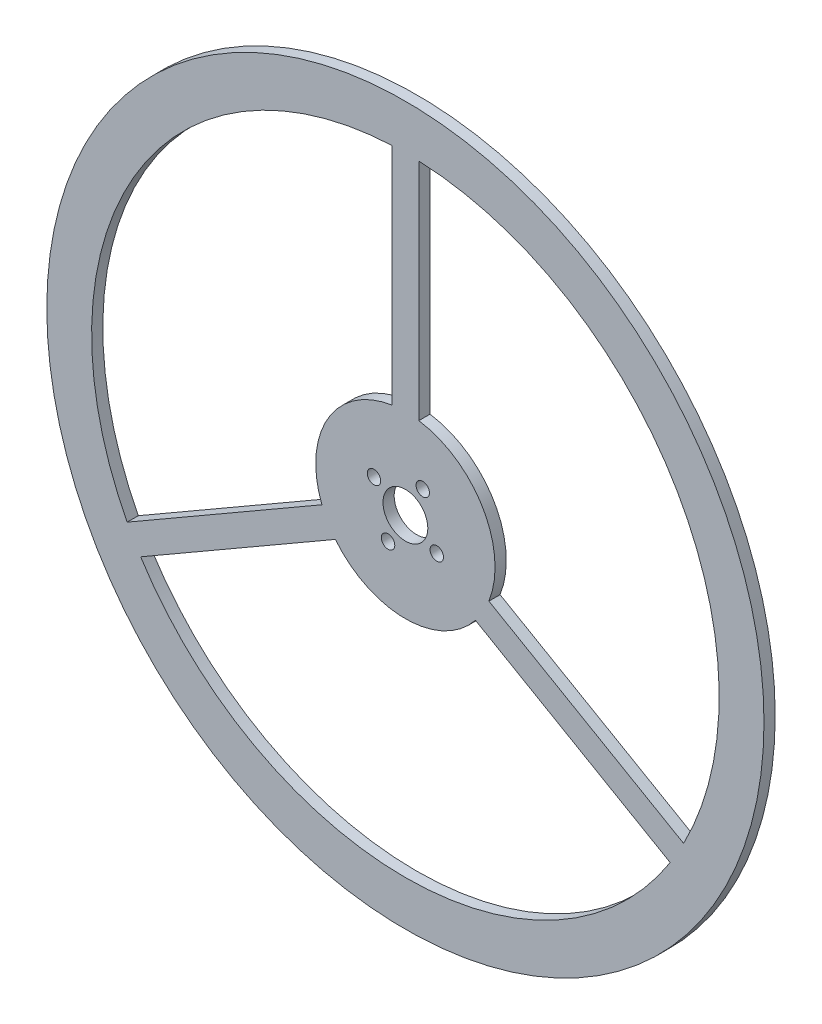
ISO-10303-21;
HEADER;
FILE_DESCRIPTION(('STEP AP214'),'2;1');
FILE_NAME('part.step','',(''),(''),'','','');
FILE_SCHEMA(('AUTOMOTIVE_DESIGN { 1 0 10303 214 1 1 1 1 }'));
ENDSEC;
DATA;
#1=APPLICATION_CONTEXT('core data for automotive mechanical design processes');
#2=APPLICATION_PROTOCOL_DEFINITION('international standard','automotive_design',2000,#1);
#3=PRODUCT_CONTEXT('',#1,'mechanical');
#4=PRODUCT('Part','Part','',(#3));
#5=PRODUCT_RELATED_PRODUCT_CATEGORY('part','',(#4));
#6=PRODUCT_DEFINITION_FORMATION('','',#4);
#7=PRODUCT_DEFINITION_CONTEXT('part definition',#1,'design');
#8=PRODUCT_DEFINITION('design','',#6,#7);
#9=PRODUCT_DEFINITION_SHAPE('','',#8);
#10=(LENGTH_UNIT() NAMED_UNIT(*) SI_UNIT(.MILLI.,.METRE.));
#11=(NAMED_UNIT(*) PLANE_ANGLE_UNIT() SI_UNIT($,.RADIAN.));
#12=(NAMED_UNIT(*) SI_UNIT($,.STERADIAN.) SOLID_ANGLE_UNIT());
#13=UNCERTAINTY_MEASURE_WITH_UNIT(LENGTH_MEASURE(1.E-05),#10,'distance_accuracy_value','');
#14=(GEOMETRIC_REPRESENTATION_CONTEXT(3) GLOBAL_UNCERTAINTY_ASSIGNED_CONTEXT((#13)) GLOBAL_UNIT_ASSIGNED_CONTEXT((#10,
#11,#12)) REPRESENTATION_CONTEXT('',''));
#15=CARTESIAN_POINT('',(0.,0.,0.));
#16=DIRECTION('',(0.,0.,1.));
#17=DIRECTION('',(1.,0.,0.));
#18=AXIS2_PLACEMENT_3D('',#15,#16,#17);
#19=CARTESIAN_POINT('',(0.,0.,2.5));
#20=DIRECTION('',(0.,0.,1.));
#21=DIRECTION('',(1.,0.,0.));
#22=AXIS2_PLACEMENT_3D('',#19,#20,#21);
#23=PLANE('',#22);
#24=CARTESIAN_POINT('',(7.00088135362442,-3.87138996646863,2.5));
#25=DIRECTION('',(0.,0.,-1.));
#26=DIRECTION('',(-1.,0.,0.));
#27=AXIS2_PLACEMENT_3D('',#24,#25,#26);
#28=CIRCLE('',#27,1.5);
#29=CARTESIAN_POINT('',(5.50088135362442,-3.87138996646863,2.5));
#30=VERTEX_POINT('',#29);
#31=EDGE_CURVE('E155',#30,#30,#28,.T.);
#32=ORIENTED_EDGE('',*,*,#31,.T.);
#33=EDGE_LOOP('',(#32));
#34=FACE_BOUND('',#33,.T.);
#35=CARTESIAN_POINT('',(3.87138996646861,7.00088135362444,2.5));
#36=DIRECTION('',(0.,0.,-1.));
#37=DIRECTION('',(-1.,0.,0.));
#38=AXIS2_PLACEMENT_3D('',#35,#36,#37);
#39=CIRCLE('',#38,1.5);
#40=CARTESIAN_POINT('',(2.37138996646861,7.00088135362444,2.5));
#41=VERTEX_POINT('',#40);
#42=EDGE_CURVE('E499',#41,#41,#39,.T.);
#43=ORIENTED_EDGE('',*,*,#42,.T.);
#44=EDGE_LOOP('',(#43));
#45=FACE_BOUND('',#44,.T.);
#46=CARTESIAN_POINT('',(-7.00088135362445,3.87138996646858,2.5));
#47=DIRECTION('',(0.,0.,-1.));
#48=DIRECTION('',(-1.,0.,0.));
#49=AXIS2_PLACEMENT_3D('',#46,#47,#48);
#50=CIRCLE('',#49,1.5);
#51=CARTESIAN_POINT('',(-8.50088135362445,3.87138996646858,2.5));
#52=VERTEX_POINT('',#51);
#53=EDGE_CURVE('E507',#52,#52,#50,.T.);
#54=ORIENTED_EDGE('',*,*,#53,.T.);
#55=EDGE_LOOP('',(#54));
#56=FACE_BOUND('',#55,.T.);
#57=CARTESIAN_POINT('',(-3.87138996646856,-7.00088135362446,2.5));
#58=DIRECTION('',(0.,0.,-1.));
#59=DIRECTION('',(-1.,0.,0.));
#60=AXIS2_PLACEMENT_3D('',#57,#58,#59);
#61=CIRCLE('',#60,1.5);
#62=CARTESIAN_POINT('',(-5.37138996646856,-7.00088135362446,2.5));
#63=VERTEX_POINT('',#62);
#64=EDGE_CURVE('E512',#63,#63,#61,.T.);
#65=ORIENTED_EDGE('',*,*,#64,.T.);
#66=EDGE_LOOP('',(#65));
#67=FACE_BOUND('',#66,.T.);
#68=DIRECTION('',(0.,1.,0.));
#69=VECTOR('',#68,1.);
#70=CARTESIAN_POINT('',(-3.,19.7737199332852,2.5));
#71=LINE('',#70,#69);
#72=CARTESIAN_POINT('',(-3.,19.7737199332852,2.5));
#73=VERTEX_POINT('',#72);
#74=CARTESIAN_POINT('',(-3.,69.9356847396235,2.5));
#75=VERTEX_POINT('',#74);
#76=EDGE_CURVE('E204',#73,#75,#71,.T.);
#77=ORIENTED_EDGE('',*,*,#76,.F.);
#78=CARTESIAN_POINT('',(0.,0.,2.5));
#79=DIRECTION('',(0.,0.,-1.));
#80=DIRECTION('',(1.,0.,0.));
#81=AXIS2_PLACEMENT_3D('',#78,#79,#80);
#82=CIRCLE('',#81,20.);
#83=CARTESIAN_POINT('',(-18.6245437895437,-7.28878375528927,2.5));
#84=VERTEX_POINT('',#83);
#85=EDGE_CURVE('E202',#84,#73,#82,.T.);
#86=ORIENTED_EDGE('',*,*,#85,.F.);
#87=DIRECTION('',(0.866025403784438,0.5,0.));
#88=VECTOR('',#87,1.);
#89=CARTESIAN_POINT('',(-18.6245437895437,-7.28878375528927,2.5));
#90=LINE('',#89,#88);
#91=CARTESIAN_POINT('',(-62.0660796155736,-32.3697661584584,2.5));
#92=VERTEX_POINT('',#91);
#93=EDGE_CURVE('E210',#92,#84,#90,.T.);
#94=ORIENTED_EDGE('',*,*,#93,.F.);
#95=CARTESIAN_POINT('',(0.,0.,2.5));
#96=DIRECTION('',(0.,0.,1.));
#97=DIRECTION('',(1.,0.,0.));
#98=AXIS2_PLACEMENT_3D('',#95,#96,#97);
#99=CIRCLE('',#98,70.);
#100=EDGE_CURVE('E207',#75,#92,#99,.T.);
#101=ORIENTED_EDGE('',*,*,#100,.F.);
#102=EDGE_LOOP('',(#77,#86,#94,#101));
#103=FACE_BOUND('',#102,.T.);
#104=CARTESIAN_POINT('',(0.,0.,2.5));
#105=DIRECTION('',(0.,0.,1.));
#106=DIRECTION('',(1.,0.,0.));
#107=AXIS2_PLACEMENT_3D('',#104,#105,#106);
#108=CIRCLE('',#107,80.);
#109=CARTESIAN_POINT('',(80.,0.,2.5));
#110=VERTEX_POINT('',#109);
#111=EDGE_CURVE('E11',#110,#110,#108,.T.);
#112=ORIENTED_EDGE('',*,*,#111,.T.);
#113=EDGE_LOOP('',(#112));
#114=FACE_BOUND('',#113,.T.);
#115=CARTESIAN_POINT('',(0.,0.,2.5));
#116=DIRECTION('',(0.,0.,1.));
#117=DIRECTION('',(1.,0.,0.));
#118=AXIS2_PLACEMENT_3D('',#115,#116,#117);
#119=CIRCLE('',#118,5.);
#120=CARTESIAN_POINT('',(5.,0.,2.5));
#121=VERTEX_POINT('',#120);
#122=EDGE_CURVE('E196',#121,#121,#119,.T.);
#123=ORIENTED_EDGE('',*,*,#122,.F.);
#124=EDGE_LOOP('',(#123));
#125=FACE_BOUND('',#124,.T.);
#126=DIRECTION('',(0.866025403784439,-0.5,0.));
#127=VECTOR('',#126,1.);
#128=CARTESIAN_POINT('',(18.6245437895437,-7.28878375528927,2.5));
#129=LINE('',#128,#127);
#130=CARTESIAN_POINT('',(18.6245437895437,-7.28878375528927,2.5));
#131=VERTEX_POINT('',#130);
#132=CARTESIAN_POINT('',(62.0660796155736,-32.3697661584584,2.5));
#133=VERTEX_POINT('',#132);
#134=EDGE_CURVE('E167',#131,#133,#129,.T.);
#135=ORIENTED_EDGE('',*,*,#134,.F.);
#136=CARTESIAN_POINT('',(0.,0.,2.5));
#137=DIRECTION('',(0.,0.,-1.));
#138=DIRECTION('',(1.,0.,0.));
#139=AXIS2_PLACEMENT_3D('',#136,#137,#138);
#140=CIRCLE('',#139,20.);
#141=CARTESIAN_POINT('',(3.,19.7737199332852,2.5));
#142=VERTEX_POINT('',#141);
#143=EDGE_CURVE('E165',#142,#131,#140,.T.);
#144=ORIENTED_EDGE('',*,*,#143,.F.);
#145=DIRECTION('',(0.,-1.,0.));
#146=VECTOR('',#145,1.);
#147=CARTESIAN_POINT('',(3.,19.7737199332852,2.5));
#148=LINE('',#147,#146);
#149=CARTESIAN_POINT('',(3.,69.9356847396235,2.5));
#150=VERTEX_POINT('',#149);
#151=EDGE_CURVE('E173',#150,#142,#148,.T.);
#152=ORIENTED_EDGE('',*,*,#151,.F.);
#153=CARTESIAN_POINT('',(0.,0.,2.5));
#154=DIRECTION('',(0.,0.,1.));
#155=DIRECTION('',(1.,0.,0.));
#156=AXIS2_PLACEMENT_3D('',#153,#154,#155);
#157=CIRCLE('',#156,70.);
#158=EDGE_CURVE('E170',#133,#150,#157,.T.);
#159=ORIENTED_EDGE('',*,*,#158,.F.);
#160=EDGE_LOOP('',(#135,#144,#152,#159));
#161=FACE_BOUND('',#160,.T.);
#162=DIRECTION('',(-0.866025403784438,-0.5,0.));
#163=VECTOR('',#162,1.);
#164=CARTESIAN_POINT('',(-15.6245437895437,-12.4849361779959,2.5));
#165=LINE('',#164,#163);
#166=CARTESIAN_POINT('',(-15.6245437895437,-12.4849361779959,2.5));
#167=VERTEX_POINT('',#166);
#168=CARTESIAN_POINT('',(-59.0660796155736,-37.5659185811651,2.5));
#169=VERTEX_POINT('',#168);
#170=EDGE_CURVE('E135',#167,#169,#165,.T.);
#171=ORIENTED_EDGE('',*,*,#170,.F.);
#172=CARTESIAN_POINT('',(0.,0.,2.5));
#173=DIRECTION('',(0.,0.,-1.));
#174=DIRECTION('',(1.,0.,0.));
#175=AXIS2_PLACEMENT_3D('',#172,#173,#174);
#176=CIRCLE('',#175,20.);
#177=CARTESIAN_POINT('',(15.6245437895437,-12.4849361779959,2.5));
#178=VERTEX_POINT('',#177);
#179=EDGE_CURVE('E127',#178,#167,#176,.T.);
#180=ORIENTED_EDGE('',*,*,#179,.F.);
#181=DIRECTION('',(-0.866025403784439,0.5,0.));
#182=VECTOR('',#181,1.);
#183=CARTESIAN_POINT('',(15.6245437895437,-12.4849361779959,2.5));
#184=LINE('',#183,#182);
#185=CARTESIAN_POINT('',(59.0660796155736,-37.565918581165,2.5));
#186=VERTEX_POINT('',#185);
#187=EDGE_CURVE('E149',#186,#178,#184,.T.);
#188=ORIENTED_EDGE('',*,*,#187,.F.);
#189=CARTESIAN_POINT('',(0.,0.,2.5));
#190=DIRECTION('',(0.,0.,1.));
#191=DIRECTION('',(1.,0.,0.));
#192=AXIS2_PLACEMENT_3D('',#189,#190,#191);
#193=CIRCLE('',#192,70.);
#194=EDGE_CURVE('E147',#169,#186,#193,.T.);
#195=ORIENTED_EDGE('',*,*,#194,.F.);
#196=EDGE_LOOP('',(#171,#180,#188,#195));
#197=FACE_BOUND('',#196,.T.);
#198=ADVANCED_FACE('F38',(#34,#45,#56,#67,#103,#114,#125,#161,#197),#23,.T.);
#199=CARTESIAN_POINT('',(0.,0.,0.));
#200=DIRECTION('',(0.,0.,1.));
#201=DIRECTION('',(1.,0.,0.));
#202=AXIS2_PLACEMENT_3D('',#199,#200,#201);
#203=PLANE('',#202);
#204=CARTESIAN_POINT('',(7.00088135362442,-3.87138996646863,0.));
#205=DIRECTION('',(0.,0.,-1.));
#206=DIRECTION('',(-1.,0.,0.));
#207=AXIS2_PLACEMENT_3D('',#204,#205,#206);
#208=CIRCLE('',#207,1.5);
#209=CARTESIAN_POINT('',(5.50088135362442,-3.87138996646863,0.));
#210=VERTEX_POINT('',#209);
#211=EDGE_CURVE('E494',#210,#210,#208,.T.);
#212=ORIENTED_EDGE('',*,*,#211,.F.);
#213=EDGE_LOOP('',(#212));
#214=FACE_BOUND('',#213,.T.);
#215=CARTESIAN_POINT('',(3.87138996646861,7.00088135362444,0.));
#216=DIRECTION('',(0.,0.,-1.));
#217=DIRECTION('',(-1.,0.,0.));
#218=AXIS2_PLACEMENT_3D('',#215,#216,#217);
#219=CIRCLE('',#218,1.5);
#220=CARTESIAN_POINT('',(2.37138996646861,7.00088135362444,0.));
#221=VERTEX_POINT('',#220);
#222=EDGE_CURVE('E495',#221,#221,#219,.T.);
#223=ORIENTED_EDGE('',*,*,#222,.F.);
#224=EDGE_LOOP('',(#223));
#225=FACE_BOUND('',#224,.T.);
#226=CARTESIAN_POINT('',(-7.00088135362445,3.87138996646858,0.));
#227=DIRECTION('',(0.,0.,-1.));
#228=DIRECTION('',(-1.,0.,0.));
#229=AXIS2_PLACEMENT_3D('',#226,#227,#228);
#230=CIRCLE('',#229,1.5);
#231=CARTESIAN_POINT('',(-8.50088135362445,3.87138996646858,0.));
#232=VERTEX_POINT('',#231);
#233=EDGE_CURVE('E504',#232,#232,#230,.T.);
#234=ORIENTED_EDGE('',*,*,#233,.F.);
#235=EDGE_LOOP('',(#234));
#236=FACE_BOUND('',#235,.T.);
#237=CARTESIAN_POINT('',(-3.87138996646856,-7.00088135362446,0.));
#238=DIRECTION('',(0.,0.,-1.));
#239=DIRECTION('',(-1.,0.,0.));
#240=AXIS2_PLACEMENT_3D('',#237,#238,#239);
#241=CIRCLE('',#240,1.5);
#242=CARTESIAN_POINT('',(-5.37138996646856,-7.00088135362446,0.));
#243=VERTEX_POINT('',#242);
#244=EDGE_CURVE('E510',#243,#243,#241,.T.);
#245=ORIENTED_EDGE('',*,*,#244,.F.);
#246=EDGE_LOOP('',(#245));
#247=FACE_BOUND('',#246,.T.);
#248=CARTESIAN_POINT('',(0.,0.,0.));
#249=DIRECTION('',(0.,0.,-1.));
#250=DIRECTION('',(1.,0.,0.));
#251=AXIS2_PLACEMENT_3D('',#248,#249,#250);
#252=CIRCLE('',#251,20.);
#253=CARTESIAN_POINT('',(3.,19.7737199332852,0.));
#254=VERTEX_POINT('',#253);
#255=CARTESIAN_POINT('',(18.6245437895437,-7.28878375528927,0.));
#256=VERTEX_POINT('',#255);
#257=EDGE_CURVE('E143',#254,#256,#252,.T.);
#258=ORIENTED_EDGE('',*,*,#257,.T.);
#259=DIRECTION('',(0.866025403784439,-0.5,0.));
#260=VECTOR('',#259,1.);
#261=CARTESIAN_POINT('',(18.6245437895437,-7.28878375528927,0.));
#262=LINE('',#261,#260);
#263=CARTESIAN_POINT('',(62.0660796155736,-32.3697661584584,0.));
#264=VERTEX_POINT('',#263);
#265=EDGE_CURVE('E178',#256,#264,#262,.T.);
#266=ORIENTED_EDGE('',*,*,#265,.T.);
#267=CARTESIAN_POINT('',(0.,0.,0.));
#268=DIRECTION('',(0.,0.,1.));
#269=DIRECTION('',(1.,0.,0.));
#270=AXIS2_PLACEMENT_3D('',#267,#268,#269);
#271=CIRCLE('',#270,70.);
#272=CARTESIAN_POINT('',(3.,69.9356847396235,0.));
#273=VERTEX_POINT('',#272);
#274=EDGE_CURVE('E181',#264,#273,#271,.T.);
#275=ORIENTED_EDGE('',*,*,#274,.T.);
#276=DIRECTION('',(0.,-1.,0.));
#277=VECTOR('',#276,1.);
#278=CARTESIAN_POINT('',(3.,19.7737199332852,0.));
#279=LINE('',#278,#277);
#280=EDGE_CURVE('E168',#273,#254,#279,.T.);
#281=ORIENTED_EDGE('',*,*,#280,.T.);
#282=EDGE_LOOP('',(#258,#266,#275,#281));
#283=FACE_BOUND('',#282,.T.);
#284=CARTESIAN_POINT('',(0.,0.,0.));
#285=DIRECTION('',(0.,0.,1.));
#286=DIRECTION('',(1.,0.,0.));
#287=AXIS2_PLACEMENT_3D('',#284,#285,#286);
#288=CIRCLE('',#287,80.);
#289=CARTESIAN_POINT('',(80.,0.,0.));
#290=VERTEX_POINT('',#289);
#291=EDGE_CURVE('E42',#290,#290,#288,.T.);
#292=ORIENTED_EDGE('',*,*,#291,.F.);
#293=EDGE_LOOP('',(#292));
#294=FACE_BOUND('',#293,.T.);
#295=CARTESIAN_POINT('',(0.,0.,0.));
#296=DIRECTION('',(0.,0.,-1.));
#297=DIRECTION('',(1.,0.,0.));
#298=AXIS2_PLACEMENT_3D('',#295,#296,#297);
#299=CIRCLE('',#298,20.);
#300=CARTESIAN_POINT('',(-18.6245437895437,-7.28878375528927,0.));
#301=VERTEX_POINT('',#300);
#302=CARTESIAN_POINT('',(-3.,19.7737199332852,0.));
#303=VERTEX_POINT('',#302);
#304=EDGE_CURVE('E199',#301,#303,#299,.T.);
#305=ORIENTED_EDGE('',*,*,#304,.T.);
#306=DIRECTION('',(0.,1.,0.));
#307=VECTOR('',#306,1.);
#308=CARTESIAN_POINT('',(-3.,19.7737199332852,0.));
#309=LINE('',#308,#307);
#310=CARTESIAN_POINT('',(-3.,69.9356847396235,0.));
#311=VERTEX_POINT('',#310);
#312=EDGE_CURVE('E215',#303,#311,#309,.T.);
#313=ORIENTED_EDGE('',*,*,#312,.T.);
#314=CARTESIAN_POINT('',(0.,0.,0.));
#315=DIRECTION('',(0.,0.,1.));
#316=DIRECTION('',(1.,0.,0.));
#317=AXIS2_PLACEMENT_3D('',#314,#315,#316);
#318=CIRCLE('',#317,70.);
#319=CARTESIAN_POINT('',(-62.0660796155736,-32.3697661584584,0.));
#320=VERTEX_POINT('',#319);
#321=EDGE_CURVE('E218',#311,#320,#318,.T.);
#322=ORIENTED_EDGE('',*,*,#321,.T.);
#323=DIRECTION('',(0.866025403784438,0.5,0.));
#324=VECTOR('',#323,1.);
#325=CARTESIAN_POINT('',(-18.6245437895437,-7.28878375528927,0.));
#326=LINE('',#325,#324);
#327=EDGE_CURVE('E205',#320,#301,#326,.T.);
#328=ORIENTED_EDGE('',*,*,#327,.T.);
#329=EDGE_LOOP('',(#305,#313,#322,#328));
#330=FACE_BOUND('',#329,.T.);
#331=CARTESIAN_POINT('',(0.,0.,0.));
#332=DIRECTION('',(0.,0.,1.));
#333=DIRECTION('',(1.,0.,0.));
#334=AXIS2_PLACEMENT_3D('',#331,#332,#333);
#335=CIRCLE('',#334,5.);
#336=CARTESIAN_POINT('',(5.,0.,0.));
#337=VERTEX_POINT('',#336);
#338=EDGE_CURVE('E195',#337,#337,#335,.T.);
#339=ORIENTED_EDGE('',*,*,#338,.T.);
#340=EDGE_LOOP('',(#339));
#341=FACE_BOUND('',#340,.T.);
#342=CARTESIAN_POINT('',(0.,0.,0.));
#343=DIRECTION('',(0.,0.,-1.));
#344=DIRECTION('',(1.,0.,0.));
#345=AXIS2_PLACEMENT_3D('',#342,#343,#344);
#346=CIRCLE('',#345,20.);
#347=CARTESIAN_POINT('',(15.6245437895437,-12.4849361779959,0.));
#348=VERTEX_POINT('',#347);
#349=CARTESIAN_POINT('',(-15.6245437895437,-12.4849361779959,0.));
#350=VERTEX_POINT('',#349);
#351=EDGE_CURVE('E61',#348,#350,#346,.T.);
#352=ORIENTED_EDGE('',*,*,#351,.T.);
#353=DIRECTION('',(-0.866025403784438,-0.5,0.));
#354=VECTOR('',#353,1.);
#355=CARTESIAN_POINT('',(-15.6245437895437,-12.4849361779959,0.));
#356=LINE('',#355,#354);
#357=CARTESIAN_POINT('',(-59.0660796155736,-37.5659185811651,0.));
#358=VERTEX_POINT('',#357);
#359=EDGE_CURVE('E142',#350,#358,#356,.T.);
#360=ORIENTED_EDGE('',*,*,#359,.T.);
#361=CARTESIAN_POINT('',(0.,0.,0.));
#362=DIRECTION('',(0.,0.,1.));
#363=DIRECTION('',(1.,0.,0.));
#364=AXIS2_PLACEMENT_3D('',#361,#362,#363);
#365=CIRCLE('',#364,70.);
#366=CARTESIAN_POINT('',(59.0660796155736,-37.565918581165,0.));
#367=VERTEX_POINT('',#366);
#368=EDGE_CURVE('E157',#358,#367,#365,.T.);
#369=ORIENTED_EDGE('',*,*,#368,.T.);
#370=DIRECTION('',(-0.866025403784439,0.5,0.));
#371=VECTOR('',#370,1.);
#372=CARTESIAN_POINT('',(15.6245437895437,-12.4849361779959,0.));
#373=LINE('',#372,#371);
#374=EDGE_CURVE('E136',#367,#348,#373,.T.);
#375=ORIENTED_EDGE('',*,*,#374,.T.);
#376=EDGE_LOOP('',(#352,#360,#369,#375));
#377=FACE_BOUND('',#376,.T.);
#378=ADVANCED_FACE('F237',(#214,#225,#236,#247,#283,#294,#330,#341,#377),#203,.F.);
#379=CARTESIAN_POINT('',(0.,0.,2.5));
#380=DIRECTION('',(0.,0.,-1.));
#381=DIRECTION('',(-1.,0.,0.));
#382=AXIS2_PLACEMENT_3D('',#379,#380,#381);
#383=CYLINDRICAL_SURFACE('',#382,80.);
#384=ORIENTED_EDGE('',*,*,#111,.F.);
#385=EDGE_LOOP('',(#384));
#386=FACE_BOUND('',#385,.T.);
#387=ORIENTED_EDGE('',*,*,#291,.T.);
#388=EDGE_LOOP('',(#387));
#389=FACE_BOUND('',#388,.T.);
#390=ADVANCED_FACE('F40',(#386,#389),#383,.T.);
#391=CARTESIAN_POINT('',(0.,0.,2.5));
#392=DIRECTION('',(0.,0.,-1.));
#393=DIRECTION('',(-1.,0.,0.));
#394=AXIS2_PLACEMENT_3D('',#391,#392,#393);
#395=CYLINDRICAL_SURFACE('',#394,20.);
#396=ORIENTED_EDGE('',*,*,#304,.F.);
#397=DIRECTION('',(0.,0.,-1.));
#398=VECTOR('',#397,1.);
#399=CARTESIAN_POINT('',(-18.6245437895437,-7.28878375528927,2.5));
#400=LINE('',#399,#398);
#401=EDGE_CURVE('E212',#84,#301,#400,.T.);
#402=ORIENTED_EDGE('',*,*,#401,.F.);
#403=ORIENTED_EDGE('',*,*,#85,.T.);
#404=DIRECTION('',(0.,0.,-1.));
#405=VECTOR('',#404,1.);
#406=CARTESIAN_POINT('',(-3.,19.7737199332852,2.5));
#407=LINE('',#406,#405);
#408=EDGE_CURVE('E229',#73,#303,#407,.T.);
#409=ORIENTED_EDGE('',*,*,#408,.T.);
#410=EDGE_LOOP('',(#396,#402,#403,#409));
#411=FACE_BOUND('',#410,.T.);
#412=ADVANCED_FACE('F267',(#411),#395,.T.);
#413=CARTESIAN_POINT('',(-3.,19.7737199332852,2.5));
#414=DIRECTION('',(-1.,0.,0.));
#415=DIRECTION('',(0.,0.,1.));
#416=AXIS2_PLACEMENT_3D('',#413,#414,#415);
#417=PLANE('',#416);
#418=ORIENTED_EDGE('',*,*,#312,.F.);
#419=ORIENTED_EDGE('',*,*,#408,.F.);
#420=ORIENTED_EDGE('',*,*,#76,.T.);
#421=DIRECTION('',(0.,0.,-1.));
#422=VECTOR('',#421,1.);
#423=CARTESIAN_POINT('',(-3.,69.9356847396235,2.5));
#424=LINE('',#423,#422);
#425=EDGE_CURVE('E227',#75,#311,#424,.T.);
#426=ORIENTED_EDGE('',*,*,#425,.T.);
#427=EDGE_LOOP('',(#418,#419,#420,#426));
#428=FACE_BOUND('',#427,.T.);
#429=ADVANCED_FACE('F270',(#428),#417,.T.);
#430=CARTESIAN_POINT('',(0.,0.,2.5));
#431=DIRECTION('',(0.,0.,-1.));
#432=DIRECTION('',(-1.,0.,0.));
#433=AXIS2_PLACEMENT_3D('',#430,#431,#432);
#434=CYLINDRICAL_SURFACE('',#433,70.);
#435=ORIENTED_EDGE('',*,*,#321,.F.);
#436=ORIENTED_EDGE('',*,*,#425,.F.);
#437=ORIENTED_EDGE('',*,*,#100,.T.);
#438=DIRECTION('',(0.,0.,-1.));
#439=VECTOR('',#438,1.);
#440=CARTESIAN_POINT('',(-62.0660796155736,-32.3697661584584,2.5));
#441=LINE('',#440,#439);
#442=EDGE_CURVE('E225',#92,#320,#441,.T.);
#443=ORIENTED_EDGE('',*,*,#442,.T.);
#444=EDGE_LOOP('',(#435,#436,#437,#443));
#445=FACE_BOUND('',#444,.T.);
#446=ADVANCED_FACE('F273',(#445),#434,.F.);
#447=CARTESIAN_POINT('',(-18.6245437895437,-7.28878375528927,2.5));
#448=DIRECTION('',(-0.5,0.866025403784439,0.));
#449=DIRECTION('',(-0.866025403784439,-0.5,0.));
#450=AXIS2_PLACEMENT_3D('',#447,#448,#449);
#451=PLANE('',#450);
#452=ORIENTED_EDGE('',*,*,#327,.F.);
#453=ORIENTED_EDGE('',*,*,#442,.F.);
#454=ORIENTED_EDGE('',*,*,#93,.T.);
#455=ORIENTED_EDGE('',*,*,#401,.T.);
#456=EDGE_LOOP('',(#452,#453,#454,#455));
#457=FACE_BOUND('',#456,.T.);
#458=ADVANCED_FACE('F277',(#457),#451,.T.);
#459=CARTESIAN_POINT('',(0.,0.,2.5));
#460=DIRECTION('',(0.,0.,-1.));
#461=DIRECTION('',(-1.,0.,0.));
#462=AXIS2_PLACEMENT_3D('',#459,#460,#461);
#463=CYLINDRICAL_SURFACE('',#462,5.);
#464=ORIENTED_EDGE('',*,*,#122,.T.);
#465=EDGE_LOOP('',(#464));
#466=FACE_BOUND('',#465,.T.);
#467=ORIENTED_EDGE('',*,*,#338,.F.);
#468=EDGE_LOOP('',(#467));
#469=FACE_BOUND('',#468,.T.);
#470=ADVANCED_FACE('F281',(#466,#469),#463,.F.);
#471=CARTESIAN_POINT('',(0.,0.,2.5));
#472=DIRECTION('',(0.,0.,-1.));
#473=DIRECTION('',(-1.,0.,0.));
#474=AXIS2_PLACEMENT_3D('',#471,#472,#473);
#475=CYLINDRICAL_SURFACE('',#474,20.);
#476=ORIENTED_EDGE('',*,*,#257,.F.);
#477=DIRECTION('',(0.,0.,-1.));
#478=VECTOR('',#477,1.);
#479=CARTESIAN_POINT('',(3.,19.7737199332852,2.5));
#480=LINE('',#479,#478);
#481=EDGE_CURVE('E175',#142,#254,#480,.T.);
#482=ORIENTED_EDGE('',*,*,#481,.F.);
#483=ORIENTED_EDGE('',*,*,#143,.T.);
#484=DIRECTION('',(0.,0.,-1.));
#485=VECTOR('',#484,1.);
#486=CARTESIAN_POINT('',(18.6245437895437,-7.28878375528927,2.5));
#487=LINE('',#486,#485);
#488=EDGE_CURVE('E192',#131,#256,#487,.T.);
#489=ORIENTED_EDGE('',*,*,#488,.T.);
#490=EDGE_LOOP('',(#476,#482,#483,#489));
#491=FACE_BOUND('',#490,.T.);
#492=ADVANCED_FACE('F285',(#491),#475,.T.);
#493=CARTESIAN_POINT('',(18.6245437895437,-7.28878375528927,2.5));
#494=DIRECTION('',(0.5,0.866025403784439,0.));
#495=DIRECTION('',(-0.866025403784439,0.5,0.));
#496=AXIS2_PLACEMENT_3D('',#493,#494,#495);
#497=PLANE('',#496);
#498=ORIENTED_EDGE('',*,*,#265,.F.);
#499=ORIENTED_EDGE('',*,*,#488,.F.);
#500=ORIENTED_EDGE('',*,*,#134,.T.);
#501=DIRECTION('',(0.,0.,-1.));
#502=VECTOR('',#501,1.);
#503=CARTESIAN_POINT('',(62.0660796155736,-32.3697661584584,2.5));
#504=LINE('',#503,#502);
#505=EDGE_CURVE('E190',#133,#264,#504,.T.);
#506=ORIENTED_EDGE('',*,*,#505,.T.);
#507=EDGE_LOOP('',(#498,#499,#500,#506));
#508=FACE_BOUND('',#507,.T.);
#509=ADVANCED_FACE('F289',(#508),#497,.T.);
#510=CARTESIAN_POINT('',(0.,0.,2.5));
#511=DIRECTION('',(0.,0.,-1.));
#512=DIRECTION('',(-1.,0.,0.));
#513=AXIS2_PLACEMENT_3D('',#510,#511,#512);
#514=CYLINDRICAL_SURFACE('',#513,70.);
#515=ORIENTED_EDGE('',*,*,#274,.F.);
#516=ORIENTED_EDGE('',*,*,#505,.F.);
#517=ORIENTED_EDGE('',*,*,#158,.T.);
#518=DIRECTION('',(0.,0.,-1.));
#519=VECTOR('',#518,1.);
#520=CARTESIAN_POINT('',(3.,69.9356847396235,2.5));
#521=LINE('',#520,#519);
#522=EDGE_CURVE('E188',#150,#273,#521,.T.);
#523=ORIENTED_EDGE('',*,*,#522,.T.);
#524=EDGE_LOOP('',(#515,#516,#517,#523));
#525=FACE_BOUND('',#524,.T.);
#526=ADVANCED_FACE('F293',(#525),#514,.F.);
#527=CARTESIAN_POINT('',(3.,19.7737199332852,2.5));
#528=DIRECTION('',(1.,0.,0.));
#529=DIRECTION('',(0.,0.,-1.));
#530=AXIS2_PLACEMENT_3D('',#527,#528,#529);
#531=PLANE('',#530);
#532=ORIENTED_EDGE('',*,*,#280,.F.);
#533=ORIENTED_EDGE('',*,*,#522,.F.);
#534=ORIENTED_EDGE('',*,*,#151,.T.);
#535=ORIENTED_EDGE('',*,*,#481,.T.);
#536=EDGE_LOOP('',(#532,#533,#534,#535));
#537=FACE_BOUND('',#536,.T.);
#538=ADVANCED_FACE('F297',(#537),#531,.T.);
#539=CARTESIAN_POINT('',(0.,0.,2.5));
#540=DIRECTION('',(0.,0.,-1.));
#541=DIRECTION('',(-1.,0.,0.));
#542=AXIS2_PLACEMENT_3D('',#539,#540,#541);
#543=CYLINDRICAL_SURFACE('',#542,20.);
#544=ORIENTED_EDGE('',*,*,#351,.F.);
#545=DIRECTION('',(0.,0.,-1.));
#546=VECTOR('',#545,1.);
#547=CARTESIAN_POINT('',(15.6245437895437,-12.4849361779959,2.5));
#548=LINE('',#547,#546);
#549=EDGE_CURVE('E131',#178,#348,#548,.T.);
#550=ORIENTED_EDGE('',*,*,#549,.F.);
#551=ORIENTED_EDGE('',*,*,#179,.T.);
#552=DIRECTION('',(0.,0.,-1.));
#553=VECTOR('',#552,1.);
#554=CARTESIAN_POINT('',(-15.6245437895437,-12.4849361779959,2.5));
#555=LINE('',#554,#553);
#556=EDGE_CURVE('E130',#167,#350,#555,.T.);
#557=ORIENTED_EDGE('',*,*,#556,.T.);
#558=EDGE_LOOP('',(#544,#550,#551,#557));
#559=FACE_BOUND('',#558,.T.);
#560=ADVANCED_FACE('F129',(#559),#543,.T.);
#561=CARTESIAN_POINT('',(-15.6245437895437,-12.4849361779959,2.5));
#562=DIRECTION('',(0.5,-0.866025403784438,0.));
#563=DIRECTION('',(0.866025403784439,0.5,0.));
#564=AXIS2_PLACEMENT_3D('',#561,#562,#563);
#565=PLANE('',#564);
#566=ORIENTED_EDGE('',*,*,#359,.F.);
#567=ORIENTED_EDGE('',*,*,#556,.F.);
#568=ORIENTED_EDGE('',*,*,#170,.T.);
#569=DIRECTION('',(0.,0.,-1.));
#570=VECTOR('',#569,1.);
#571=CARTESIAN_POINT('',(-59.0660796155736,-37.5659185811651,2.5));
#572=LINE('',#571,#570);
#573=EDGE_CURVE('E144',#169,#358,#572,.T.);
#574=ORIENTED_EDGE('',*,*,#573,.T.);
#575=EDGE_LOOP('',(#566,#567,#568,#574));
#576=FACE_BOUND('',#575,.T.);
#577=ADVANCED_FACE('F139',(#576),#565,.T.);
#578=CARTESIAN_POINT('',(0.,0.,2.5));
#579=DIRECTION('',(0.,0.,-1.));
#580=DIRECTION('',(-1.,0.,0.));
#581=AXIS2_PLACEMENT_3D('',#578,#579,#580);
#582=CYLINDRICAL_SURFACE('',#581,70.);
#583=ORIENTED_EDGE('',*,*,#368,.F.);
#584=ORIENTED_EDGE('',*,*,#573,.F.);
#585=ORIENTED_EDGE('',*,*,#194,.T.);
#586=DIRECTION('',(0.,0.,-1.));
#587=VECTOR('',#586,1.);
#588=CARTESIAN_POINT('',(59.0660796155736,-37.565918581165,2.5));
#589=LINE('',#588,#587);
#590=EDGE_CURVE('E53',#186,#367,#589,.T.);
#591=ORIENTED_EDGE('',*,*,#590,.T.);
#592=EDGE_LOOP('',(#583,#584,#585,#591));
#593=FACE_BOUND('',#592,.T.);
#594=ADVANCED_FACE('F248',(#593),#582,.F.);
#595=CARTESIAN_POINT('',(15.6245437895437,-12.4849361779959,2.5));
#596=DIRECTION('',(-0.5,-0.866025403784439,0.));
#597=DIRECTION('',(0.866025403784439,-0.5,0.));
#598=AXIS2_PLACEMENT_3D('',#595,#596,#597);
#599=PLANE('',#598);
#600=ORIENTED_EDGE('',*,*,#374,.F.);
#601=ORIENTED_EDGE('',*,*,#590,.F.);
#602=ORIENTED_EDGE('',*,*,#187,.T.);
#603=ORIENTED_EDGE('',*,*,#549,.T.);
#604=EDGE_LOOP('',(#600,#601,#602,#603));
#605=FACE_BOUND('',#604,.T.);
#606=ADVANCED_FACE('F245',(#605),#599,.T.);
#607=CARTESIAN_POINT('',(-3.87138996646856,-7.00088135362446,2.5));
#608=DIRECTION('',(0.,0.,-1.));
#609=DIRECTION('',(-1.,0.,0.));
#610=AXIS2_PLACEMENT_3D('',#607,#608,#609);
#611=CYLINDRICAL_SURFACE('',#610,1.5);
#612=ORIENTED_EDGE('',*,*,#64,.F.);
#613=EDGE_LOOP('',(#612));
#614=FACE_BOUND('',#613,.T.);
#615=ORIENTED_EDGE('',*,*,#244,.T.);
#616=EDGE_LOOP('',(#615));
#617=FACE_BOUND('',#616,.T.);
#618=ADVANCED_FACE('F247',(#614,#617),#611,.F.);
#619=CARTESIAN_POINT('',(-7.00088135362445,3.87138996646858,2.5));
#620=DIRECTION('',(0.,0.,-1.));
#621=DIRECTION('',(-1.,0.,0.));
#622=AXIS2_PLACEMENT_3D('',#619,#620,#621);
#623=CYLINDRICAL_SURFACE('',#622,1.5);
#624=ORIENTED_EDGE('',*,*,#53,.F.);
#625=EDGE_LOOP('',(#624));
#626=FACE_BOUND('',#625,.T.);
#627=ORIENTED_EDGE('',*,*,#233,.T.);
#628=EDGE_LOOP('',(#627));
#629=FACE_BOUND('',#628,.T.);
#630=ADVANCED_FACE('F254',(#626,#629),#623,.F.);
#631=CARTESIAN_POINT('',(3.87138996646861,7.00088135362444,2.5));
#632=DIRECTION('',(0.,0.,-1.));
#633=DIRECTION('',(-1.,0.,0.));
#634=AXIS2_PLACEMENT_3D('',#631,#632,#633);
#635=CYLINDRICAL_SURFACE('',#634,1.5);
#636=ORIENTED_EDGE('',*,*,#42,.F.);
#637=EDGE_LOOP('',(#636));
#638=FACE_BOUND('',#637,.T.);
#639=ORIENTED_EDGE('',*,*,#222,.T.);
#640=EDGE_LOOP('',(#639));
#641=FACE_BOUND('',#640,.T.);
#642=ADVANCED_FACE('F349',(#638,#641),#635,.F.);
#643=CARTESIAN_POINT('',(7.00088135362442,-3.87138996646863,2.5));
#644=DIRECTION('',(0.,0.,-1.));
#645=DIRECTION('',(-1.,0.,0.));
#646=AXIS2_PLACEMENT_3D('',#643,#644,#645);
#647=CYLINDRICAL_SURFACE('',#646,1.5);
#648=ORIENTED_EDGE('',*,*,#31,.F.);
#649=EDGE_LOOP('',(#648));
#650=FACE_BOUND('',#649,.T.);
#651=ORIENTED_EDGE('',*,*,#211,.T.);
#652=EDGE_LOOP('',(#651));
#653=FACE_BOUND('',#652,.T.);
#654=ADVANCED_FACE('F360',(#650,#653),#647,.F.);
#655=CLOSED_SHELL('',(#198,#378,#390,#412,#429,#446,#458,#470,#492,#509,#526,#538,#560,#577,
#594,#606,#618,#630,#642,#654));
#656=MANIFOLD_SOLID_BREP('B2',#655);
#657=ADVANCED_BREP_SHAPE_REPRESENTATION('',(#18,#656),#14);
#658=SHAPE_DEFINITION_REPRESENTATION(#9,#657);
ENDSEC;
END-ISO-10303-21;
